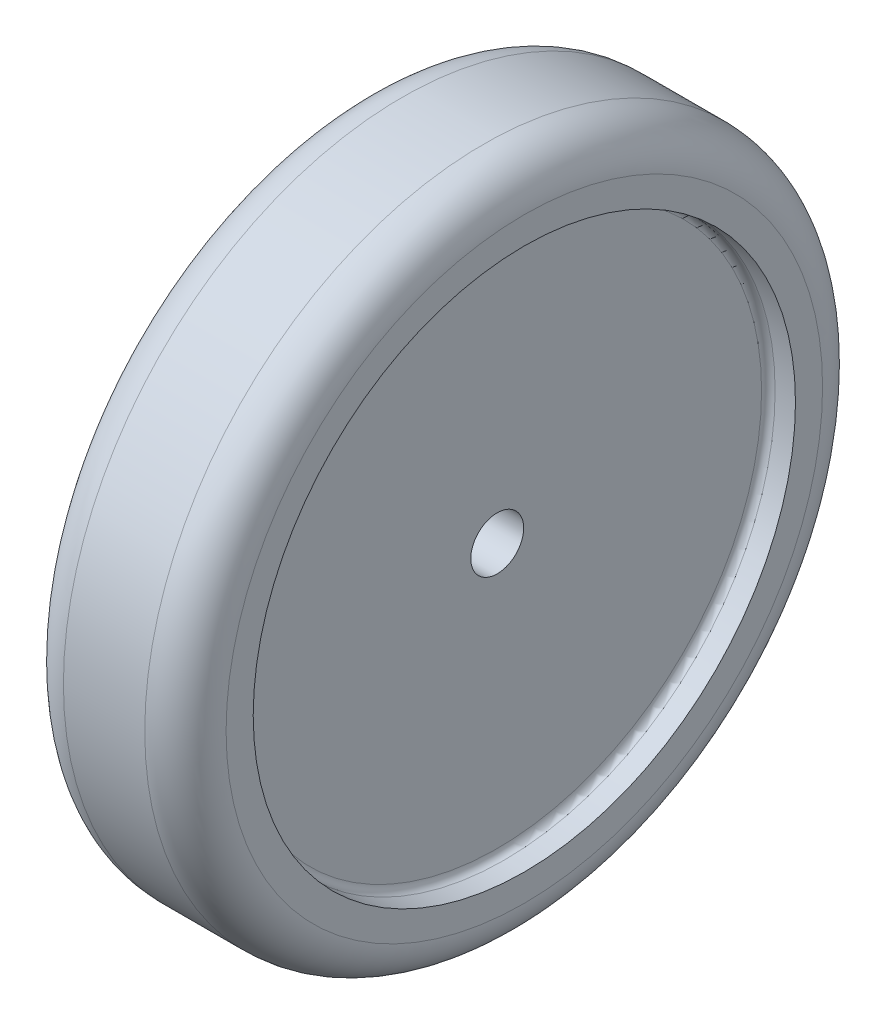
ISO-10303-21;
HEADER;
FILE_DESCRIPTION(('STEP AP214'),'2;1');
FILE_NAME('part.step','',(''),(''),'','','');
FILE_SCHEMA(('AUTOMOTIVE_DESIGN { 1 0 10303 214 1 1 1 1 }'));
ENDSEC;
DATA;
#1=APPLICATION_CONTEXT('core data for automotive mechanical design processes');
#2=APPLICATION_PROTOCOL_DEFINITION('international standard','automotive_design',2000,#1);
#3=PRODUCT_CONTEXT('',#1,'mechanical');
#4=PRODUCT('Part','Part','',(#3));
#5=PRODUCT_RELATED_PRODUCT_CATEGORY('part','',(#4));
#6=PRODUCT_DEFINITION_FORMATION('','',#4);
#7=PRODUCT_DEFINITION_CONTEXT('part definition',#1,'design');
#8=PRODUCT_DEFINITION('design','',#6,#7);
#9=PRODUCT_DEFINITION_SHAPE('','',#8);
#10=(LENGTH_UNIT() NAMED_UNIT(*) SI_UNIT(.MILLI.,.METRE.));
#11=(NAMED_UNIT(*) PLANE_ANGLE_UNIT() SI_UNIT($,.RADIAN.));
#12=(NAMED_UNIT(*) SI_UNIT($,.STERADIAN.) SOLID_ANGLE_UNIT());
#13=UNCERTAINTY_MEASURE_WITH_UNIT(LENGTH_MEASURE(1.E-05),#10,'distance_accuracy_value','');
#14=(GEOMETRIC_REPRESENTATION_CONTEXT(3) GLOBAL_UNCERTAINTY_ASSIGNED_CONTEXT((#13)) GLOBAL_UNIT_ASSIGNED_CONTEXT((#10,
#11,#12)) REPRESENTATION_CONTEXT('',''));
#15=CARTESIAN_POINT('',(0.,0.,0.));
#16=DIRECTION('',(0.,0.,1.));
#17=DIRECTION('',(1.,0.,0.));
#18=AXIS2_PLACEMENT_3D('',#15,#16,#17);
#19=CARTESIAN_POINT('',(30.48,0.,0.));
#20=DIRECTION('',(-1.,0.,0.));
#21=DIRECTION('',(0.,0.,1.));
#22=AXIS2_PLACEMENT_3D('',#19,#20,#21);
#23=CYLINDRICAL_SURFACE('',#22,63.5000000000001);
#24=CARTESIAN_POINT('',(7.62,0.,0.));
#25=DIRECTION('',(1.,0.,0.));
#26=DIRECTION('',(0.,0.,-1.));
#27=AXIS2_PLACEMENT_3D('',#24,#25,#26);
#28=CIRCLE('',#27,63.5000000000001);
#29=CARTESIAN_POINT('',(7.61999999999999,0.,63.5000000000001));
#30=VERTEX_POINT('',#29);
#31=EDGE_CURVE('E68',#30,#30,#28,.T.);
#32=CARTESIAN_POINT('',(22.86,0.,0.));
#33=DIRECTION('',(1.,0.,0.));
#34=DIRECTION('',(0.,0.,-1.));
#35=AXIS2_PLACEMENT_3D('',#32,#33,#34);
#36=CIRCLE('',#35,63.5000000000001);
#37=CARTESIAN_POINT('',(22.86,0.,63.5000000000001));
#38=VERTEX_POINT('',#37);
#39=EDGE_CURVE('E58',#38,#38,#36,.F.);
#40=CARTESIAN_POINT('',(7.61999999999999,0.,63.5000000000001));
#41=CARTESIAN_POINT('',(7.77875,0.,63.5000000000001));
#42=CARTESIAN_POINT('',(7.93749999999999,0.,63.5000000000001));
#43=CARTESIAN_POINT('',(8.255,0.,63.5000000000001));
#44=CARTESIAN_POINT('',(8.41375,0.,63.5000000000001));
#45=CARTESIAN_POINT('',(8.73125,0.,63.5000000000001));
#46=CARTESIAN_POINT('',(8.89,0.,63.5000000000001));
#47=CARTESIAN_POINT('',(9.2075,0.,63.5000000000001));
#48=CARTESIAN_POINT('',(9.36624999999999,0.,63.5000000000001));
#49=CARTESIAN_POINT('',(9.68375,0.,63.5000000000001));
#50=CARTESIAN_POINT('',(9.8425,0.,63.5000000000001));
#51=CARTESIAN_POINT('',(10.16,0.,63.5000000000001));
#52=CARTESIAN_POINT('',(10.31875,0.,63.5000000000001));
#53=CARTESIAN_POINT('',(10.63625,0.,63.5000000000001));
#54=CARTESIAN_POINT('',(10.795,0.,63.5000000000001));
#55=CARTESIAN_POINT('',(11.1125,0.,63.5000000000001));
#56=CARTESIAN_POINT('',(11.27125,0.,63.5000000000001));
#57=CARTESIAN_POINT('',(11.58875,0.,63.5000000000001));
#58=CARTESIAN_POINT('',(11.7475,0.,63.5000000000001));
#59=CARTESIAN_POINT('',(12.065,0.,63.5000000000001));
#60=CARTESIAN_POINT('',(12.22375,0.,63.5000000000001));
#61=CARTESIAN_POINT('',(12.54125,0.,63.5000000000001));
#62=CARTESIAN_POINT('',(12.7,0.,63.5000000000001));
#63=CARTESIAN_POINT('',(13.0175,0.,63.5000000000001));
#64=CARTESIAN_POINT('',(13.17625,0.,63.5000000000001));
#65=CARTESIAN_POINT('',(13.49375,0.,63.5000000000001));
#66=CARTESIAN_POINT('',(13.6525,0.,63.5000000000001));
#67=CARTESIAN_POINT('',(13.97,0.,63.5000000000001));
#68=CARTESIAN_POINT('',(14.12875,0.,63.5000000000001));
#69=CARTESIAN_POINT('',(14.44625,0.,63.5000000000001));
#70=CARTESIAN_POINT('',(14.605,0.,63.5000000000001));
#71=CARTESIAN_POINT('',(14.9225,0.,63.5000000000001));
#72=CARTESIAN_POINT('',(15.08125,0.,63.5000000000001));
#73=CARTESIAN_POINT('',(15.39875,0.,63.5000000000001));
#74=CARTESIAN_POINT('',(15.5575,0.,63.5000000000001));
#75=CARTESIAN_POINT('',(15.875,0.,63.5000000000001));
#76=CARTESIAN_POINT('',(16.03375,0.,63.5000000000001));
#77=CARTESIAN_POINT('',(16.35125,0.,63.5000000000001));
#78=CARTESIAN_POINT('',(16.51,0.,63.5000000000001));
#79=CARTESIAN_POINT('',(16.8275,0.,63.5000000000001));
#80=CARTESIAN_POINT('',(16.98625,0.,63.5000000000001));
#81=CARTESIAN_POINT('',(17.30375,0.,63.5000000000001));
#82=CARTESIAN_POINT('',(17.4625,0.,63.5000000000001));
#83=CARTESIAN_POINT('',(17.78,0.,63.5000000000001));
#84=CARTESIAN_POINT('',(17.93875,0.,63.5000000000001));
#85=CARTESIAN_POINT('',(18.25625,0.,63.5000000000001));
#86=CARTESIAN_POINT('',(18.415,0.,63.5000000000001));
#87=CARTESIAN_POINT('',(18.7325,0.,63.5000000000001));
#88=CARTESIAN_POINT('',(18.89125,0.,63.5000000000001));
#89=CARTESIAN_POINT('',(19.20875,0.,63.5000000000001));
#90=CARTESIAN_POINT('',(19.3675,0.,63.5000000000001));
#91=CARTESIAN_POINT('',(19.685,0.,63.5000000000001));
#92=CARTESIAN_POINT('',(19.84375,0.,63.5000000000001));
#93=CARTESIAN_POINT('',(20.16125,0.,63.5000000000001));
#94=CARTESIAN_POINT('',(20.32,0.,63.5000000000001));
#95=CARTESIAN_POINT('',(20.6375,0.,63.5000000000001));
#96=CARTESIAN_POINT('',(20.79625,0.,63.5000000000001));
#97=CARTESIAN_POINT('',(21.11375,0.,63.5000000000001));
#98=CARTESIAN_POINT('',(21.2725,0.,63.5000000000001));
#99=CARTESIAN_POINT('',(21.59,0.,63.5000000000001));
#100=CARTESIAN_POINT('',(21.74875,0.,63.5000000000001));
#101=CARTESIAN_POINT('',(22.06625,0.,63.5000000000001));
#102=CARTESIAN_POINT('',(22.225,0.,63.5000000000001));
#103=CARTESIAN_POINT('',(22.5425,0.,63.5000000000001));
#104=CARTESIAN_POINT('',(22.70125,0.,63.5000000000001));
#105=CARTESIAN_POINT('',(22.86,0.,63.5000000000001));
#106=B_SPLINE_CURVE_WITH_KNOTS('',3,(#40,#41,#42,#43,#44,#45,#46,#47,#48,#49,#50,#51,#52,#53,
#54,#55,#56,#57,#58,#59,#60,#61,#62,#63,#64,#65,#66,#67,#68,#69,#70,#71,#72,#73,#74,#75,#76,#77,
#78,#79,#80,#81,#82,#83,#84,#85,#86,#87,#88,#89,#90,#91,#92,#93,#94,#95,#96,#97,#98,#99,#100,
#101,#102,#103,#104,#105),.UNSPECIFIED.,.F.,.F.,(4,2,2,2,2,2,2,2,2,2,2,2,2,2,2,2,2,2,2,2,2,2,2,
2,2,2,2,2,2,2,2,2,4),(0.,0.476250000000001,0.952500000000002,1.42875,1.905,2.38125,2.8575,
3.33375,3.81,4.28625,4.7625,5.23875,5.715,6.19125,6.6675,7.14375,7.62,8.09625,8.5725,9.04875,
9.525,10.00125,10.4775,10.95375,11.43,11.90625,12.3825,12.85875,13.335,13.81125,14.2875,
14.76375,15.24),.UNSPECIFIED.);
#107=EDGE_CURVE('BSEAM34',#30,#38,#106,.T.);
#108=ORIENTED_EDGE('',*,*,#31,.T.);
#109=ORIENTED_EDGE('',*,*,#39,.T.);
#110=ORIENTED_EDGE('',*,*,#107,.T.);
#111=ORIENTED_EDGE('',*,*,#107,.F.);
#112=EDGE_LOOP('',(#108,#110,#109,#111));
#113=FACE_BOUND('',#112,.T.);
#114=ADVANCED_FACE('F34',(#113),#23,.T.);
#115=CARTESIAN_POINT('',(30.48,0.,0.));
#116=DIRECTION('',(1.,0.,0.));
#117=DIRECTION('',(0.,0.,-1.));
#118=AXIS2_PLACEMENT_3D('',#115,#116,#117);
#119=PLANE('',#118);
#120=CARTESIAN_POINT('',(30.48,0.,0.));
#121=DIRECTION('',(-1.,0.,0.));
#122=DIRECTION('',(0.,0.,1.));
#123=AXIS2_PLACEMENT_3D('',#120,#121,#122);
#124=CIRCLE('',#123,50.8);
#125=CARTESIAN_POINT('',(30.48,0.,50.8));
#126=VERTEX_POINT('',#125);
#127=EDGE_CURVE('E73',#126,#126,#124,.T.);
#128=ORIENTED_EDGE('',*,*,#127,.T.);
#129=EDGE_LOOP('',(#128));
#130=FACE_BOUND('',#129,.T.);
#131=CARTESIAN_POINT('',(30.48,0.,0.));
#132=DIRECTION('',(1.,0.,0.));
#133=DIRECTION('',(0.,0.,-1.));
#134=AXIS2_PLACEMENT_3D('',#131,#132,#133);
#135=CIRCLE('',#134,55.8800000000001);
#136=CARTESIAN_POINT('',(30.48,0.,-55.8800000000001));
#137=VERTEX_POINT('',#136);
#138=EDGE_CURVE('E54',#137,#137,#135,.T.);
#139=ORIENTED_EDGE('',*,*,#138,.T.);
#140=EDGE_LOOP('',(#139));
#141=FACE_BOUND('',#140,.T.);
#142=ADVANCED_FACE('F85',(#130,#141),#119,.T.);
#143=CARTESIAN_POINT('',(0.,0.,0.));
#144=DIRECTION('',(1.,0.,0.));
#145=DIRECTION('',(0.,0.,-1.));
#146=AXIS2_PLACEMENT_3D('',#143,#144,#145);
#147=PLANE('',#146);
#148=CARTESIAN_POINT('',(0.,0.,0.));
#149=DIRECTION('',(-1.,0.,0.));
#150=DIRECTION('',(0.,0.,1.));
#151=AXIS2_PLACEMENT_3D('',#148,#149,#150);
#152=CIRCLE('',#151,50.8);
#153=CARTESIAN_POINT('',(0.,0.,50.8));
#154=VERTEX_POINT('',#153);
#155=EDGE_CURVE('E62',#154,#154,#152,.T.);
#156=ORIENTED_EDGE('',*,*,#155,.F.);
#157=EDGE_LOOP('',(#156));
#158=FACE_BOUND('',#157,.T.);
#159=CARTESIAN_POINT('',(0.,0.,0.));
#160=DIRECTION('',(1.,0.,0.));
#161=DIRECTION('',(0.,0.,-1.));
#162=AXIS2_PLACEMENT_3D('',#159,#160,#161);
#163=CIRCLE('',#162,55.8800000000001);
#164=CARTESIAN_POINT('',(0.,0.,-55.8800000000001));
#165=VERTEX_POINT('',#164);
#166=EDGE_CURVE('E65',#165,#165,#163,.F.);
#167=ORIENTED_EDGE('',*,*,#166,.T.);
#168=EDGE_LOOP('',(#167));
#169=FACE_BOUND('',#168,.T.);
#170=ADVANCED_FACE('F81',(#158,#169),#147,.F.);
#171=CARTESIAN_POINT('',(7.62,0.,0.));
#172=DIRECTION('',(1.,0.,0.));
#173=DIRECTION('',(0.,0.,-1.));
#174=AXIS2_PLACEMENT_3D('',#171,#172,#173);
#175=TOROIDAL_SURFACE('',#174,55.8800000000001,7.62);
#176=ORIENTED_EDGE('',*,*,#166,.F.);
#177=EDGE_LOOP('',(#176));
#178=FACE_BOUND('',#177,.T.);
#179=ORIENTED_EDGE('',*,*,#31,.F.);
#180=EDGE_LOOP('',(#179));
#181=FACE_BOUND('',#180,.T.);
#182=ADVANCED_FACE('F84',(#178,#181),#175,.T.);
#183=CARTESIAN_POINT('',(22.86,0.,0.));
#184=DIRECTION('',(1.,0.,0.));
#185=DIRECTION('',(0.,0.,-1.));
#186=AXIS2_PLACEMENT_3D('',#183,#184,#185);
#187=TOROIDAL_SURFACE('',#186,55.8800000000001,7.62);
#188=ORIENTED_EDGE('',*,*,#39,.F.);
#189=EDGE_LOOP('',(#188));
#190=FACE_BOUND('',#189,.T.);
#191=ORIENTED_EDGE('',*,*,#138,.F.);
#192=EDGE_LOOP('',(#191));
#193=FACE_BOUND('',#192,.T.);
#194=ADVANCED_FACE('F91',(#190,#193),#187,.T.);
#195=CARTESIAN_POINT('',(25.4,0.,0.));
#196=DIRECTION('',(1.,0.,0.));
#197=DIRECTION('',(0.,0.,-1.));
#198=AXIS2_PLACEMENT_3D('',#195,#196,#197);
#199=PLANE('',#198);
#200=CARTESIAN_POINT('',(25.4,0.,0.));
#201=DIRECTION('',(1.,0.,0.));
#202=DIRECTION('',(0.,0.,-1.));
#203=AXIS2_PLACEMENT_3D('',#200,#201,#202);
#204=CIRCLE('',#203,49.53);
#205=CARTESIAN_POINT('',(25.4,0.,-49.53));
#206=VERTEX_POINT('',#205);
#207=EDGE_CURVE('E10',#206,#206,#204,.T.);
#208=ORIENTED_EDGE('',*,*,#207,.T.);
#209=EDGE_LOOP('',(#208));
#210=FACE_BOUND('',#209,.T.);
#211=CARTESIAN_POINT('',(25.4,0.,0.));
#212=DIRECTION('',(1.,0.,0.));
#213=DIRECTION('',(0.,0.,-1.));
#214=AXIS2_PLACEMENT_3D('',#211,#212,#213);
#215=CIRCLE('',#214,4.953);
#216=CARTESIAN_POINT('',(25.4,0.,-4.953));
#217=VERTEX_POINT('',#216);
#218=EDGE_CURVE('E59',#217,#217,#215,.F.);
#219=ORIENTED_EDGE('',*,*,#218,.T.);
#220=EDGE_LOOP('',(#219));
#221=FACE_BOUND('',#220,.T.);
#222=ADVANCED_FACE('F102',(#210,#221),#199,.T.);
#223=CARTESIAN_POINT('',(0.,0.,0.));
#224=DIRECTION('',(-1.,0.,0.));
#225=DIRECTION('',(0.,0.,1.));
#226=AXIS2_PLACEMENT_3D('',#223,#224,#225);
#227=CYLINDRICAL_SURFACE('',#226,50.8);
#228=CARTESIAN_POINT('',(26.67,0.,0.));
#229=DIRECTION('',(1.,0.,0.));
#230=DIRECTION('',(0.,0.,-1.));
#231=AXIS2_PLACEMENT_3D('',#228,#229,#230);
#232=CIRCLE('',#231,50.8);
#233=CARTESIAN_POINT('',(26.67,0.,-50.8));
#234=VERTEX_POINT('',#233);
#235=EDGE_CURVE('E41',#234,#234,#232,.F.);
#236=ORIENTED_EDGE('',*,*,#235,.T.);
#237=EDGE_LOOP('',(#236));
#238=FACE_BOUND('',#237,.T.);
#239=ORIENTED_EDGE('',*,*,#127,.F.);
#240=EDGE_LOOP('',(#239));
#241=FACE_BOUND('',#240,.T.);
#242=ADVANCED_FACE('F130',(#238,#241),#227,.F.);
#243=CARTESIAN_POINT('',(5.08,0.,0.));
#244=DIRECTION('',(-1.,0.,0.));
#245=DIRECTION('',(0.,0.,1.));
#246=AXIS2_PLACEMENT_3D('',#243,#244,#245);
#247=PLANE('',#246);
#248=CARTESIAN_POINT('',(5.08,0.,0.));
#249=DIRECTION('',(-1.,0.,0.));
#250=DIRECTION('',(0.,0.,1.));
#251=AXIS2_PLACEMENT_3D('',#248,#249,#250);
#252=CIRCLE('',#251,49.53);
#253=CARTESIAN_POINT('',(5.08,0.,49.53));
#254=VERTEX_POINT('',#253);
#255=EDGE_CURVE('E49',#254,#254,#252,.T.);
#256=ORIENTED_EDGE('',*,*,#255,.T.);
#257=EDGE_LOOP('',(#256));
#258=FACE_BOUND('',#257,.T.);
#259=CARTESIAN_POINT('',(5.08,0.,0.));
#260=DIRECTION('',(-1.,0.,0.));
#261=DIRECTION('',(0.,0.,1.));
#262=AXIS2_PLACEMENT_3D('',#259,#260,#261);
#263=CIRCLE('',#262,4.953);
#264=CARTESIAN_POINT('',(5.08,0.,-4.953));
#265=VERTEX_POINT('',#264);
#266=EDGE_CURVE('E55',#265,#265,#263,.F.);
#267=ORIENTED_EDGE('',*,*,#266,.T.);
#268=EDGE_LOOP('',(#267));
#269=FACE_BOUND('',#268,.T.);
#270=ADVANCED_FACE('F127',(#258,#269),#247,.T.);
#271=CARTESIAN_POINT('',(0.,0.,0.));
#272=DIRECTION('',(-1.,0.,0.));
#273=DIRECTION('',(0.,0.,1.));
#274=AXIS2_PLACEMENT_3D('',#271,#272,#273);
#275=CYLINDRICAL_SURFACE('',#274,50.8);
#276=CARTESIAN_POINT('',(3.81,0.,0.));
#277=DIRECTION('',(-1.,0.,0.));
#278=DIRECTION('',(0.,0.,1.));
#279=AXIS2_PLACEMENT_3D('',#276,#277,#278);
#280=CIRCLE('',#279,50.8);
#281=CARTESIAN_POINT('',(3.81,0.,50.8));
#282=VERTEX_POINT('',#281);
#283=EDGE_CURVE('E45',#282,#282,#280,.F.);
#284=ORIENTED_EDGE('',*,*,#283,.T.);
#285=EDGE_LOOP('',(#284));
#286=FACE_BOUND('',#285,.T.);
#287=ORIENTED_EDGE('',*,*,#155,.T.);
#288=EDGE_LOOP('',(#287));
#289=FACE_BOUND('',#288,.T.);
#290=ADVANCED_FACE('F79',(#286,#289),#275,.F.);
#291=CARTESIAN_POINT('',(-14.0091995488679,0.,0.));
#292=DIRECTION('',(1.,0.,0.));
#293=DIRECTION('',(0.,0.,-1.));
#294=AXIS2_PLACEMENT_3D('',#291,#292,#293);
#295=CYLINDRICAL_SURFACE('',#294,4.953);
#296=CARTESIAN_POINT('',(25.4,0.,-4.953));
#297=CARTESIAN_POINT('',(25.1883333333333,0.,-4.953));
#298=CARTESIAN_POINT('',(24.9766666666667,0.,-4.953));
#299=CARTESIAN_POINT('',(24.5533333333333,0.,-4.953));
#300=CARTESIAN_POINT('',(24.3416666666667,0.,-4.953));
#301=CARTESIAN_POINT('',(23.9183333333333,0.,-4.953));
#302=CARTESIAN_POINT('',(23.7066666666667,0.,-4.953));
#303=CARTESIAN_POINT('',(23.2833333333333,0.,-4.953));
#304=CARTESIAN_POINT('',(23.0716666666667,0.,-4.953));
#305=CARTESIAN_POINT('',(22.6483333333333,0.,-4.953));
#306=CARTESIAN_POINT('',(22.4366666666667,0.,-4.953));
#307=CARTESIAN_POINT('',(22.0133333333333,0.,-4.953));
#308=CARTESIAN_POINT('',(21.8016666666667,0.,-4.953));
#309=CARTESIAN_POINT('',(21.3783333333333,0.,-4.953));
#310=CARTESIAN_POINT('',(21.1666666666667,0.,-4.953));
#311=CARTESIAN_POINT('',(20.7433333333333,0.,-4.953));
#312=CARTESIAN_POINT('',(20.5316666666667,0.,-4.953));
#313=CARTESIAN_POINT('',(20.1083333333333,0.,-4.953));
#314=CARTESIAN_POINT('',(19.8966666666667,0.,-4.953));
#315=CARTESIAN_POINT('',(19.4733333333333,0.,-4.953));
#316=CARTESIAN_POINT('',(19.2616666666667,0.,-4.953));
#317=CARTESIAN_POINT('',(18.8383333333333,0.,-4.953));
#318=CARTESIAN_POINT('',(18.6266666666667,0.,-4.953));
#319=CARTESIAN_POINT('',(18.2033333333333,0.,-4.953));
#320=CARTESIAN_POINT('',(17.9916666666667,0.,-4.953));
#321=CARTESIAN_POINT('',(17.5683333333333,0.,-4.953));
#322=CARTESIAN_POINT('',(17.3566666666667,0.,-4.953));
#323=CARTESIAN_POINT('',(16.9333333333333,0.,-4.953));
#324=CARTESIAN_POINT('',(16.7216666666667,0.,-4.953));
#325=CARTESIAN_POINT('',(16.2983333333333,0.,-4.953));
#326=CARTESIAN_POINT('',(16.0866666666667,0.,-4.953));
#327=CARTESIAN_POINT('',(15.6633333333333,0.,-4.953));
#328=CARTESIAN_POINT('',(15.4516666666667,0.,-4.953));
#329=CARTESIAN_POINT('',(15.0283333333333,0.,-4.953));
#330=CARTESIAN_POINT('',(14.8166666666667,0.,-4.953));
#331=CARTESIAN_POINT('',(14.3933333333333,0.,-4.953));
#332=CARTESIAN_POINT('',(14.1816666666667,0.,-4.953));
#333=CARTESIAN_POINT('',(13.7583333333333,0.,-4.953));
#334=CARTESIAN_POINT('',(13.5466666666667,0.,-4.953));
#335=CARTESIAN_POINT('',(13.1233333333333,0.,-4.953));
#336=CARTESIAN_POINT('',(12.9116666666667,0.,-4.953));
#337=CARTESIAN_POINT('',(12.4883333333333,0.,-4.953));
#338=CARTESIAN_POINT('',(12.2766666666667,0.,-4.953));
#339=CARTESIAN_POINT('',(11.8533333333333,0.,-4.953));
#340=CARTESIAN_POINT('',(11.6416666666667,0.,-4.953));
#341=CARTESIAN_POINT('',(11.2183333333333,0.,-4.953));
#342=CARTESIAN_POINT('',(11.0066666666667,0.,-4.953));
#343=CARTESIAN_POINT('',(10.5833333333333,0.,-4.953));
#344=CARTESIAN_POINT('',(10.3716666666667,0.,-4.953));
#345=CARTESIAN_POINT('',(9.94833333333333,0.,-4.953));
#346=CARTESIAN_POINT('',(9.73666666666667,0.,-4.953));
#347=CARTESIAN_POINT('',(9.31333333333333,0.,-4.953));
#348=CARTESIAN_POINT('',(9.10166666666667,0.,-4.953));
#349=CARTESIAN_POINT('',(8.67833333333333,0.,-4.953));
#350=CARTESIAN_POINT('',(8.46666666666667,0.,-4.953));
#351=CARTESIAN_POINT('',(8.04333333333333,0.,-4.953));
#352=CARTESIAN_POINT('',(7.83166666666667,0.,-4.953));
#353=CARTESIAN_POINT('',(7.40833333333333,0.,-4.953));
#354=CARTESIAN_POINT('',(7.19666666666667,0.,-4.953));
#355=CARTESIAN_POINT('',(6.77333333333334,0.,-4.953));
#356=CARTESIAN_POINT('',(6.56166666666667,0.,-4.953));
#357=CARTESIAN_POINT('',(6.13833333333334,0.,-4.953));
#358=CARTESIAN_POINT('',(5.92666666666667,0.,-4.953));
#359=CARTESIAN_POINT('',(5.50333333333333,0.,-4.953));
#360=CARTESIAN_POINT('',(5.29166666666667,0.,-4.953));
#361=CARTESIAN_POINT('',(5.08,0.,-4.953));
#362=B_SPLINE_CURVE_WITH_KNOTS('',3,(#296,#297,#298,#299,#300,#301,#302,#303,#304,#305,#306,
#307,#308,#309,#310,#311,#312,#313,#314,#315,#316,#317,#318,#319,#320,#321,#322,#323,#324,#325,
#326,#327,#328,#329,#330,#331,#332,#333,#334,#335,#336,#337,#338,#339,#340,#341,#342,#343,#344,
#345,#346,#347,#348,#349,#350,#351,#352,#353,#354,#355,#356,#357,#358,#359,#360,#361),
.UNSPECIFIED.,.F.,.F.,(4,2,2,2,2,2,2,2,2,2,2,2,2,2,2,2,2,2,2,2,2,2,2,2,2,2,2,2,2,2,2,2,4),(0.,
0.634999999999997,1.27,1.905,2.54,3.175,3.81,4.445,5.08,5.715,6.34999999999999,6.985,
7.61999999999999,8.255,8.88999999999999,9.52499999999999,10.16,10.795,11.43,12.065,12.7,13.335,
13.97,14.605,15.24,15.875,16.51,17.145,17.78,18.415,19.05,19.685,20.32),.UNSPECIFIED.);
#363=EDGE_CURVE('BSEAM112',#217,#265,#362,.T.);
#364=ORIENTED_EDGE('',*,*,#218,.F.);
#365=ORIENTED_EDGE('',*,*,#266,.F.);
#366=ORIENTED_EDGE('',*,*,#363,.T.);
#367=ORIENTED_EDGE('',*,*,#363,.F.);
#368=EDGE_LOOP('',(#364,#366,#365,#367));
#369=FACE_BOUND('',#368,.T.);
#370=ADVANCED_FACE('F112',(#369),#295,.F.);
#371=CARTESIAN_POINT('',(3.81,0.,0.));
#372=DIRECTION('',(-1.,0.,0.));
#373=DIRECTION('',(0.,0.,1.));
#374=AXIS2_PLACEMENT_3D('',#371,#372,#373);
#375=TOROIDAL_SURFACE('',#374,49.53,1.27);
#376=ORIENTED_EDGE('',*,*,#283,.F.);
#377=EDGE_LOOP('',(#376));
#378=FACE_BOUND('',#377,.T.);
#379=ORIENTED_EDGE('',*,*,#255,.F.);
#380=EDGE_LOOP('',(#379));
#381=FACE_BOUND('',#380,.T.);
#382=ADVANCED_FACE('F114',(#378,#381),#375,.F.);
#383=CARTESIAN_POINT('',(26.67,0.,0.));
#384=DIRECTION('',(1.,0.,0.));
#385=DIRECTION('',(0.,0.,-1.));
#386=AXIS2_PLACEMENT_3D('',#383,#384,#385);
#387=TOROIDAL_SURFACE('',#386,49.53,1.27);
#388=ORIENTED_EDGE('',*,*,#207,.F.);
#389=EDGE_LOOP('',(#388));
#390=FACE_BOUND('',#389,.T.);
#391=ORIENTED_EDGE('',*,*,#235,.F.);
#392=EDGE_LOOP('',(#391));
#393=FACE_BOUND('',#392,.T.);
#394=ADVANCED_FACE('F36',(#390,#393),#387,.F.);
#395=CLOSED_SHELL('',(#114,#142,#170,#182,#194,#222,#242,#270,#290,#370,#382,#394));
#396=MANIFOLD_SOLID_BREP('B2',#395);
#397=ADVANCED_BREP_SHAPE_REPRESENTATION('',(#18,#396),#14);
#398=SHAPE_DEFINITION_REPRESENTATION(#9,#397);
ENDSEC;
END-ISO-10303-21;
